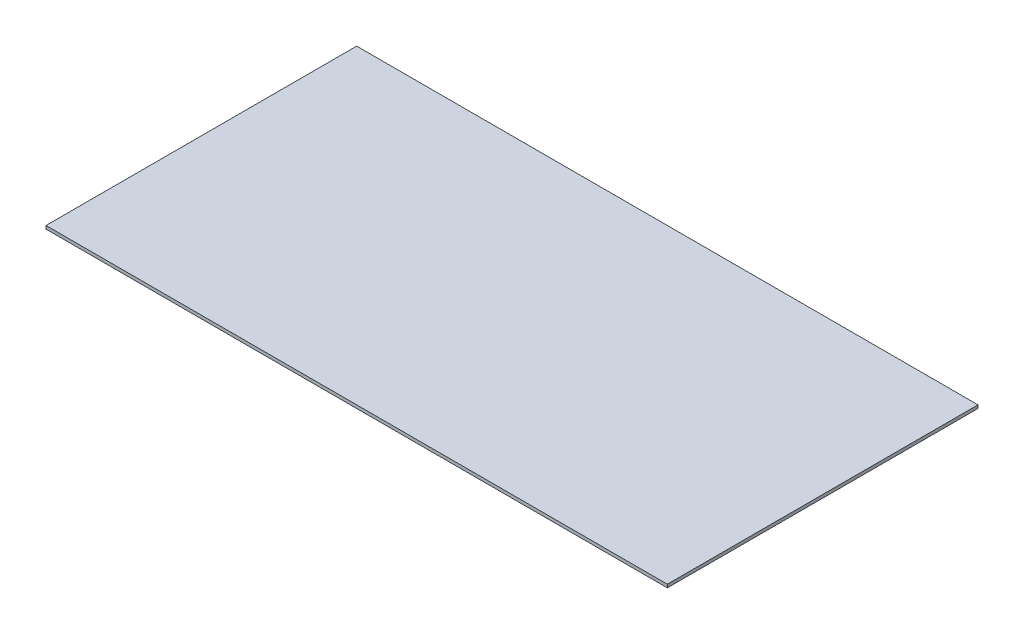
ISO-10303-21;
HEADER;
FILE_DESCRIPTION(('STEP AP214'),'2;1');
FILE_NAME('part.step','',(''),(''),'','','');
FILE_SCHEMA(('AUTOMOTIVE_DESIGN { 1 0 10303 214 1 1 1 1 }'));
ENDSEC;
DATA;
#1=APPLICATION_CONTEXT('core data for automotive mechanical design processes');
#2=APPLICATION_PROTOCOL_DEFINITION('international standard','automotive_design',2000,#1);
#3=PRODUCT_CONTEXT('',#1,'mechanical');
#4=PRODUCT('Part','Part','',(#3));
#5=PRODUCT_RELATED_PRODUCT_CATEGORY('part','',(#4));
#6=PRODUCT_DEFINITION_FORMATION('','',#4);
#7=PRODUCT_DEFINITION_CONTEXT('part definition',#1,'design');
#8=PRODUCT_DEFINITION('design','',#6,#7);
#9=PRODUCT_DEFINITION_SHAPE('','',#8);
#10=(LENGTH_UNIT() NAMED_UNIT(*) SI_UNIT(.MILLI.,.METRE.));
#11=(NAMED_UNIT(*) PLANE_ANGLE_UNIT() SI_UNIT($,.RADIAN.));
#12=(NAMED_UNIT(*) SI_UNIT($,.STERADIAN.) SOLID_ANGLE_UNIT());
#13=UNCERTAINTY_MEASURE_WITH_UNIT(LENGTH_MEASURE(1.E-05),#10,'distance_accuracy_value','');
#14=(GEOMETRIC_REPRESENTATION_CONTEXT(3) GLOBAL_UNCERTAINTY_ASSIGNED_CONTEXT((#13)) GLOBAL_UNIT_ASSIGNED_CONTEXT((#10,
#11,#12)) REPRESENTATION_CONTEXT('',''));
#15=CARTESIAN_POINT('',(0.,0.,0.));
#16=DIRECTION('',(0.,0.,1.));
#17=DIRECTION('',(1.,0.,0.));
#18=AXIS2_PLACEMENT_3D('',#15,#16,#17);
#19=CARTESIAN_POINT('',(0.,0.,0.));
#20=DIRECTION('',(0.,1.,0.));
#21=DIRECTION('',(0.,0.,1.));
#22=AXIS2_PLACEMENT_3D('',#19,#20,#21);
#23=PLANE('',#22);
#24=DIRECTION('',(1.,0.,0.));
#25=VECTOR('',#24,1.);
#26=CARTESIAN_POINT('',(0.,0.,0.));
#27=LINE('',#26,#25);
#28=CARTESIAN_POINT('',(0.,0.,0.));
#29=VERTEX_POINT('',#28);
#30=CARTESIAN_POINT('',(25.4,0.,0.));
#31=VERTEX_POINT('',#30);
#32=EDGE_CURVE('E80',#29,#31,#27,.T.);
#33=ORIENTED_EDGE('',*,*,#32,.T.);
#34=DIRECTION('',(0.,0.,1.));
#35=VECTOR('',#34,1.);
#36=CARTESIAN_POINT('',(25.4,0.,0.));
#37=LINE('',#36,#35);
#38=CARTESIAN_POINT('',(25.4,0.,12.7));
#39=VERTEX_POINT('',#38);
#40=EDGE_CURVE('E67',#31,#39,#37,.T.);
#41=ORIENTED_EDGE('',*,*,#40,.T.);
#42=DIRECTION('',(-1.,0.,0.));
#43=VECTOR('',#42,1.);
#44=CARTESIAN_POINT('',(0.,0.,12.7));
#45=LINE('',#44,#43);
#46=CARTESIAN_POINT('',(0.,0.,12.7));
#47=VERTEX_POINT('',#46);
#48=EDGE_CURVE('E54',#39,#47,#45,.T.);
#49=ORIENTED_EDGE('',*,*,#48,.T.);
#50=DIRECTION('',(0.,0.,-1.));
#51=VECTOR('',#50,1.);
#52=CARTESIAN_POINT('',(0.,0.,0.));
#53=LINE('',#52,#51);
#54=EDGE_CURVE('E19',#47,#29,#53,.T.);
#55=ORIENTED_EDGE('',*,*,#54,.T.);
#56=EDGE_LOOP('',(#33,#41,#49,#55));
#57=FACE_BOUND('',#56,.T.);
#58=ADVANCED_FACE('F16',(#57),#23,.F.);
#59=CARTESIAN_POINT('',(0.,0.13,0.));
#60=DIRECTION('',(1.,0.,0.));
#61=DIRECTION('',(0.,0.,-1.));
#62=AXIS2_PLACEMENT_3D('',#59,#60,#61);
#63=PLANE('',#62);
#64=DIRECTION('',(0.,1.,0.));
#65=VECTOR('',#64,1.);
#66=CARTESIAN_POINT('',(0.,0.13,12.7));
#67=LINE('',#66,#65);
#68=CARTESIAN_POINT('',(0.,0.13,12.7));
#69=VERTEX_POINT('',#68);
#70=EDGE_CURVE('E60',#47,#69,#67,.T.);
#71=ORIENTED_EDGE('',*,*,#70,.T.);
#72=DIRECTION('',(0.,0.,1.));
#73=VECTOR('',#72,1.);
#74=CARTESIAN_POINT('',(0.,0.13,0.));
#75=LINE('',#74,#73);
#76=CARTESIAN_POINT('',(0.,0.13,0.));
#77=VERTEX_POINT('',#76);
#78=EDGE_CURVE('E82',#77,#69,#75,.T.);
#79=ORIENTED_EDGE('',*,*,#78,.F.);
#80=DIRECTION('',(0.,1.,0.));
#81=VECTOR('',#80,1.);
#82=CARTESIAN_POINT('',(0.,0.13,0.));
#83=LINE('',#82,#81);
#84=EDGE_CURVE('E63',#77,#29,#83,.F.);
#85=ORIENTED_EDGE('',*,*,#84,.T.);
#86=ORIENTED_EDGE('',*,*,#54,.F.);
#87=EDGE_LOOP('',(#71,#79,#85,#86));
#88=FACE_BOUND('',#87,.T.);
#89=ADVANCED_FACE('F59',(#88),#63,.F.);
#90=CARTESIAN_POINT('',(0.,0.13,12.7));
#91=DIRECTION('',(0.,0.,-1.));
#92=DIRECTION('',(-1.,0.,0.));
#93=AXIS2_PLACEMENT_3D('',#90,#91,#92);
#94=PLANE('',#93);
#95=DIRECTION('',(0.,1.,0.));
#96=VECTOR('',#95,1.);
#97=CARTESIAN_POINT('',(25.4,0.13,12.7));
#98=LINE('',#97,#96);
#99=CARTESIAN_POINT('',(25.4,0.13,12.7));
#100=VERTEX_POINT('',#99);
#101=EDGE_CURVE('E69',#39,#100,#98,.T.);
#102=ORIENTED_EDGE('',*,*,#101,.T.);
#103=DIRECTION('',(1.,0.,0.));
#104=VECTOR('',#103,1.);
#105=CARTESIAN_POINT('',(0.,0.13,12.7));
#106=LINE('',#105,#104);
#107=EDGE_CURVE('E73',#69,#100,#106,.T.);
#108=ORIENTED_EDGE('',*,*,#107,.F.);
#109=ORIENTED_EDGE('',*,*,#70,.F.);
#110=ORIENTED_EDGE('',*,*,#48,.F.);
#111=EDGE_LOOP('',(#102,#108,#109,#110));
#112=FACE_BOUND('',#111,.T.);
#113=ADVANCED_FACE('F71',(#112),#94,.F.);
#114=CARTESIAN_POINT('',(25.4,0.13,0.));
#115=DIRECTION('',(-1.,0.,0.));
#116=DIRECTION('',(0.,0.,1.));
#117=AXIS2_PLACEMENT_3D('',#114,#115,#116);
#118=PLANE('',#117);
#119=DIRECTION('',(0.,1.,0.));
#120=VECTOR('',#119,1.);
#121=CARTESIAN_POINT('',(25.4,0.13,0.));
#122=LINE('',#121,#120);
#123=CARTESIAN_POINT('',(25.4,0.13,0.));
#124=VERTEX_POINT('',#123);
#125=EDGE_CURVE('E34',#31,#124,#122,.T.);
#126=ORIENTED_EDGE('',*,*,#125,.T.);
#127=DIRECTION('',(0.,0.,1.));
#128=VECTOR('',#127,1.);
#129=CARTESIAN_POINT('',(25.4,0.13,0.));
#130=LINE('',#129,#128);
#131=EDGE_CURVE('E25',#100,#124,#130,.F.);
#132=ORIENTED_EDGE('',*,*,#131,.F.);
#133=ORIENTED_EDGE('',*,*,#101,.F.);
#134=ORIENTED_EDGE('',*,*,#40,.F.);
#135=EDGE_LOOP('',(#126,#132,#133,#134));
#136=FACE_BOUND('',#135,.T.);
#137=ADVANCED_FACE('F88',(#136),#118,.F.);
#138=CARTESIAN_POINT('',(0.,0.13,0.));
#139=DIRECTION('',(0.,0.,1.));
#140=DIRECTION('',(1.,0.,0.));
#141=AXIS2_PLACEMENT_3D('',#138,#139,#140);
#142=PLANE('',#141);
#143=ORIENTED_EDGE('',*,*,#84,.F.);
#144=DIRECTION('',(1.,0.,0.));
#145=VECTOR('',#144,1.);
#146=CARTESIAN_POINT('',(0.,0.13,0.));
#147=LINE('',#146,#145);
#148=EDGE_CURVE('E11',#124,#77,#147,.F.);
#149=ORIENTED_EDGE('',*,*,#148,.F.);
#150=ORIENTED_EDGE('',*,*,#125,.F.);
#151=ORIENTED_EDGE('',*,*,#32,.F.);
#152=EDGE_LOOP('',(#143,#149,#150,#151));
#153=FACE_BOUND('',#152,.T.);
#154=ADVANCED_FACE('F90',(#153),#142,.F.);
#155=CARTESIAN_POINT('',(0.,0.13,0.));
#156=DIRECTION('',(0.,1.,0.));
#157=DIRECTION('',(0.,0.,1.));
#158=AXIS2_PLACEMENT_3D('',#155,#156,#157);
#159=PLANE('',#158);
#160=ORIENTED_EDGE('',*,*,#131,.T.);
#161=ORIENTED_EDGE('',*,*,#148,.T.);
#162=ORIENTED_EDGE('',*,*,#78,.T.);
#163=ORIENTED_EDGE('',*,*,#107,.T.);
#164=EDGE_LOOP('',(#160,#161,#162,#163));
#165=FACE_BOUND('',#164,.T.);
#166=ADVANCED_FACE('F87',(#165),#159,.T.);
#167=CLOSED_SHELL('',(#58,#89,#113,#137,#154,#166));
#168=MANIFOLD_SOLID_BREP('B1',#167);
#169=ADVANCED_BREP_SHAPE_REPRESENTATION('',(#18,#168),#14);
#170=SHAPE_DEFINITION_REPRESENTATION(#9,#169);
ENDSEC;
END-ISO-10303-21;
